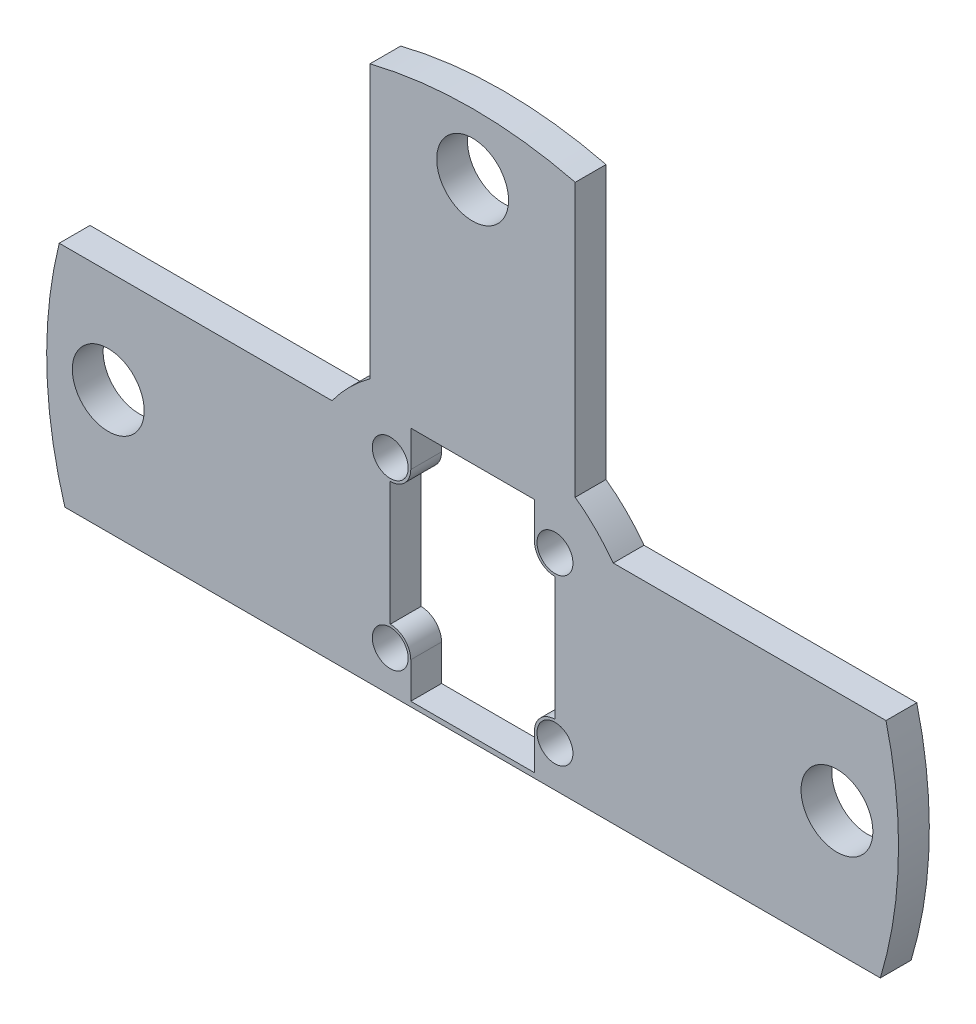
ISO-10303-21;
HEADER;
FILE_DESCRIPTION(('STEP AP214'),'2;1');
FILE_NAME('part.step','',(''),(''),'','','');
FILE_SCHEMA(('AUTOMOTIVE_DESIGN { 1 0 10303 214 1 1 1 1 }'));
ENDSEC;
DATA;
#1=APPLICATION_CONTEXT('core data for automotive mechanical design processes');
#2=APPLICATION_PROTOCOL_DEFINITION('international standard','automotive_design',2000,#1);
#3=PRODUCT_CONTEXT('',#1,'mechanical');
#4=PRODUCT('Part','Part','',(#3));
#5=PRODUCT_RELATED_PRODUCT_CATEGORY('part','',(#4));
#6=PRODUCT_DEFINITION_FORMATION('','',#4);
#7=PRODUCT_DEFINITION_CONTEXT('part definition',#1,'design');
#8=PRODUCT_DEFINITION('design','',#6,#7);
#9=PRODUCT_DEFINITION_SHAPE('','',#8);
#10=(LENGTH_UNIT() NAMED_UNIT(*) SI_UNIT(.MILLI.,.METRE.));
#11=(NAMED_UNIT(*) PLANE_ANGLE_UNIT() SI_UNIT($,.RADIAN.));
#12=(NAMED_UNIT(*) SI_UNIT($,.STERADIAN.) SOLID_ANGLE_UNIT());
#13=UNCERTAINTY_MEASURE_WITH_UNIT(LENGTH_MEASURE(1.E-05),#10,'distance_accuracy_value','');
#14=(GEOMETRIC_REPRESENTATION_CONTEXT(3) GLOBAL_UNCERTAINTY_ASSIGNED_CONTEXT((#13)) GLOBAL_UNIT_ASSIGNED_CONTEXT((#10,
#11,#12)) REPRESENTATION_CONTEXT('',''));
#15=CARTESIAN_POINT('',(0.,0.,0.));
#16=DIRECTION('',(0.,0.,1.));
#17=DIRECTION('',(1.,0.,0.));
#18=AXIS2_PLACEMENT_3D('',#15,#16,#17);
#19=CARTESIAN_POINT('',(0.,0.,52.5));
#20=DIRECTION('',(0.,0.,-1.));
#21=DIRECTION('',(-1.,0.,0.));
#22=AXIS2_PLACEMENT_3D('',#19,#20,#21);
#23=CYLINDRICAL_SURFACE('',#22,41.5);
#24=DIRECTION('',(0.,0.,1.));
#25=VECTOR('',#24,1.);
#26=CARTESIAN_POINT('',(9.99999999999996,40.2771647462927,0.));
#27=LINE('',#26,#25);
#28=CARTESIAN_POINT('',(9.99999999999996,40.2771647462927,49.5));
#29=VERTEX_POINT('',#28);
#30=CARTESIAN_POINT('',(9.99999999999996,40.2771647462927,52.5));
#31=VERTEX_POINT('',#30);
#32=EDGE_CURVE('E211',#29,#31,#27,.T.);
#33=ORIENTED_EDGE('',*,*,#32,.F.);
#34=CARTESIAN_POINT('',(0.,0.,49.5));
#35=DIRECTION('',(0.,0.,1.));
#36=DIRECTION('',(1.,0.,0.));
#37=AXIS2_PLACEMENT_3D('',#34,#35,#36);
#38=CIRCLE('',#37,41.5);
#39=CARTESIAN_POINT('',(-9.99999999999997,40.2771647462927,49.5));
#40=VERTEX_POINT('',#39);
#41=EDGE_CURVE('E199',#29,#40,#38,.T.);
#42=ORIENTED_EDGE('',*,*,#41,.T.);
#43=DIRECTION('',(0.,0.,1.));
#44=VECTOR('',#43,1.);
#45=CARTESIAN_POINT('',(-9.99999999999997,40.2771647462927,0.));
#46=LINE('',#45,#44);
#47=CARTESIAN_POINT('',(-9.99999999999997,40.2771647462927,52.5));
#48=VERTEX_POINT('',#47);
#49=EDGE_CURVE('E209',#40,#48,#46,.T.);
#50=ORIENTED_EDGE('',*,*,#49,.T.);
#51=CARTESIAN_POINT('',(0.,0.,52.5));
#52=DIRECTION('',(0.,0.,1.));
#53=DIRECTION('',(1.,0.,0.));
#54=AXIS2_PLACEMENT_3D('',#51,#52,#53);
#55=CIRCLE('',#54,41.5);
#56=EDGE_CURVE('E361',#31,#48,#55,.T.);
#57=ORIENTED_EDGE('',*,*,#56,.F.);
#58=EDGE_LOOP('',(#33,#42,#50,#57));
#59=FACE_BOUND('',#58,.T.);
#60=ADVANCED_FACE('F45',(#59),#23,.T.);
#61=DIRECTION('',(0.,0.,1.));
#62=VECTOR('',#61,1.);
#63=CARTESIAN_POINT('',(-40.2771647462927,10.,0.));
#64=LINE('',#63,#62);
#65=CARTESIAN_POINT('',(-40.2771647462927,10.,49.5));
#66=VERTEX_POINT('',#65);
#67=CARTESIAN_POINT('',(-40.2771647462927,10.,52.5));
#68=VERTEX_POINT('',#67);
#69=EDGE_CURVE('E234',#66,#68,#64,.T.);
#70=ORIENTED_EDGE('',*,*,#69,.F.);
#71=CARTESIAN_POINT('',(0.,0.,49.5));
#72=DIRECTION('',(0.,0.,1.));
#73=DIRECTION('',(1.,0.,0.));
#74=AXIS2_PLACEMENT_3D('',#71,#72,#73);
#75=CIRCLE('',#74,41.5);
#76=CARTESIAN_POINT('',(-39.7271947159625,-12.,49.5));
#77=VERTEX_POINT('',#76);
#78=EDGE_CURVE('E214',#66,#77,#75,.T.);
#79=ORIENTED_EDGE('',*,*,#78,.T.);
#80=DIRECTION('',(0.,0.,-1.));
#81=VECTOR('',#80,1.);
#82=CARTESIAN_POINT('',(-39.7271947159625,-12.,52.5));
#83=LINE('',#82,#81);
#84=CARTESIAN_POINT('',(-39.7271947159625,-12.,52.5));
#85=VERTEX_POINT('',#84);
#86=EDGE_CURVE('E360',#85,#77,#83,.T.);
#87=ORIENTED_EDGE('',*,*,#86,.F.);
#88=EDGE_CURVE('E355',#68,#85,#55,.T.);
#89=ORIENTED_EDGE('',*,*,#88,.F.);
#90=EDGE_LOOP('',(#70,#79,#87,#89));
#91=FACE_BOUND('',#90,.T.);
#92=ADVANCED_FACE('F488',(#91),#23,.T.);
#93=CARTESIAN_POINT('',(0.,0.,52.5));
#94=DIRECTION('',(0.,0.,1.));
#95=DIRECTION('',(1.,0.,0.));
#96=AXIS2_PLACEMENT_3D('',#93,#94,#95);
#97=PLANE('',#96);
#98=DIRECTION('',(0.,-1.,0.));
#99=VECTOR('',#98,1.);
#100=CARTESIAN_POINT('',(-6.025,8.025,52.5));
#101=LINE('',#100,#99);
#102=CARTESIAN_POINT('',(-6.025,11.525,52.5));
#103=VERTEX_POINT('',#102);
#104=CARTESIAN_POINT('',(-6.025,8.025,52.5));
#105=VERTEX_POINT('',#104);
#106=EDGE_CURVE('E513',#103,#105,#101,.T.);
#107=ORIENTED_EDGE('',*,*,#106,.F.);
#108=DIRECTION('',(-1.,0.,0.));
#109=VECTOR('',#108,1.);
#110=CARTESIAN_POINT('',(-6.025,11.525,52.5));
#111=LINE('',#110,#109);
#112=CARTESIAN_POINT('',(6.025,11.525,52.5));
#113=VERTEX_POINT('',#112);
#114=EDGE_CURVE('E509',#113,#103,#111,.T.);
#115=ORIENTED_EDGE('',*,*,#114,.F.);
#116=DIRECTION('',(0.,1.,0.));
#117=VECTOR('',#116,1.);
#118=CARTESIAN_POINT('',(6.025,11.525,52.5));
#119=LINE('',#118,#117);
#120=CARTESIAN_POINT('',(6.025,8.02499999999999,52.5));
#121=VERTEX_POINT('',#120);
#122=EDGE_CURVE('E449',#121,#113,#119,.T.);
#123=ORIENTED_EDGE('',*,*,#122,.F.);
#124=CARTESIAN_POINT('',(8.025,8.025,52.5));
#125=DIRECTION('',(0.,0.,-1.));
#126=DIRECTION('',(1.,0.,0.));
#127=AXIS2_PLACEMENT_3D('',#124,#125,#126);
#128=CIRCLE('',#127,2.);
#129=CARTESIAN_POINT('',(8.025,6.025,52.5));
#130=VERTEX_POINT('',#129);
#131=EDGE_CURVE('E277',#130,#121,#128,.T.);
#132=ORIENTED_EDGE('',*,*,#131,.F.);
#133=DIRECTION('',(0.,1.,0.));
#134=VECTOR('',#133,1.);
#135=CARTESIAN_POINT('',(8.025,-6.025,52.5));
#136=LINE('',#135,#134);
#137=CARTESIAN_POINT('',(8.025,-6.025,52.5));
#138=VERTEX_POINT('',#137);
#139=EDGE_CURVE('E273',#138,#130,#136,.T.);
#140=ORIENTED_EDGE('',*,*,#139,.F.);
#141=CARTESIAN_POINT('',(8.025,-8.025,52.5));
#142=DIRECTION('',(0.,0.,-1.));
#143=DIRECTION('',(1.,0.,0.));
#144=AXIS2_PLACEMENT_3D('',#141,#142,#143);
#145=CIRCLE('',#144,2.);
#146=CARTESIAN_POINT('',(6.025,-8.02499999999999,52.5));
#147=VERTEX_POINT('',#146);
#148=EDGE_CURVE('E269',#147,#138,#145,.T.);
#149=ORIENTED_EDGE('',*,*,#148,.F.);
#150=DIRECTION('',(0.,1.,0.));
#151=VECTOR('',#150,1.);
#152=CARTESIAN_POINT('',(6.025,-11.525,52.5));
#153=LINE('',#152,#151);
#154=CARTESIAN_POINT('',(6.025,-11.525,52.5));
#155=VERTEX_POINT('',#154);
#156=EDGE_CURVE('E433',#155,#147,#153,.T.);
#157=ORIENTED_EDGE('',*,*,#156,.F.);
#158=DIRECTION('',(1.,0.,0.));
#159=VECTOR('',#158,1.);
#160=CARTESIAN_POINT('',(-6.025,-11.525,52.5));
#161=LINE('',#160,#159);
#162=CARTESIAN_POINT('',(-6.025,-11.525,52.5));
#163=VERTEX_POINT('',#162);
#164=EDGE_CURVE('E437',#163,#155,#161,.T.);
#165=ORIENTED_EDGE('',*,*,#164,.F.);
#166=DIRECTION('',(0.,-1.,0.));
#167=VECTOR('',#166,1.);
#168=CARTESIAN_POINT('',(-6.025,-8.025,52.5));
#169=LINE('',#168,#167);
#170=CARTESIAN_POINT('',(-6.025,-8.025,52.5));
#171=VERTEX_POINT('',#170);
#172=EDGE_CURVE('E430',#171,#163,#169,.T.);
#173=ORIENTED_EDGE('',*,*,#172,.F.);
#174=CARTESIAN_POINT('',(-8.025,-8.025,52.5));
#175=DIRECTION('',(0.,0.,-1.));
#176=DIRECTION('',(1.,0.,0.));
#177=AXIS2_PLACEMENT_3D('',#174,#175,#176);
#178=CIRCLE('',#177,2.);
#179=CARTESIAN_POINT('',(-8.025,-6.025,52.5));
#180=VERTEX_POINT('',#179);
#181=EDGE_CURVE('E265',#180,#171,#178,.T.);
#182=ORIENTED_EDGE('',*,*,#181,.F.);
#183=DIRECTION('',(0.,-1.,0.));
#184=VECTOR('',#183,1.);
#185=CARTESIAN_POINT('',(-8.025,6.025,52.5));
#186=LINE('',#185,#184);
#187=CARTESIAN_POINT('',(-8.025,6.025,52.5));
#188=VERTEX_POINT('',#187);
#189=EDGE_CURVE('E226',#188,#180,#186,.T.);
#190=ORIENTED_EDGE('',*,*,#189,.F.);
#191=CARTESIAN_POINT('',(-8.025,8.025,52.5));
#192=DIRECTION('',(0.,0.,-1.));
#193=DIRECTION('',(1.,0.,0.));
#194=AXIS2_PLACEMENT_3D('',#191,#192,#193);
#195=CIRCLE('',#194,2.);
#196=EDGE_CURVE('E221',#105,#188,#195,.T.);
#197=ORIENTED_EDGE('',*,*,#196,.F.);
#198=EDGE_LOOP('',(#107,#115,#123,#132,#140,#149,#157,#165,#173,#182,#190,#197));
#199=FACE_BOUND('',#198,.T.);
#200=DIRECTION('',(0.,1.,0.));
#201=VECTOR('',#200,1.);
#202=CARTESIAN_POINT('',(-10.0000000000001,13.698766072022,52.5));
#203=LINE('',#202,#201);
#204=CARTESIAN_POINT('',(-10.0000000000001,13.698766072022,52.5));
#205=VERTEX_POINT('',#204);
#206=EDGE_CURVE('E218',#205,#48,#203,.T.);
#207=ORIENTED_EDGE('',*,*,#206,.F.);
#208=CARTESIAN_POINT('',(0.,0.,52.5));
#209=DIRECTION('',(0.,0.,-1.));
#210=DIRECTION('',(1.,0.,0.));
#211=AXIS2_PLACEMENT_3D('',#208,#209,#210);
#212=CIRCLE('',#211,16.9604301801571);
#213=CARTESIAN_POINT('',(-13.6987660720221,10.,52.5));
#214=VERTEX_POINT('',#213);
#215=EDGE_CURVE('E463',#214,#205,#212,.T.);
#216=ORIENTED_EDGE('',*,*,#215,.F.);
#217=DIRECTION('',(1.,0.,0.));
#218=VECTOR('',#217,1.);
#219=CARTESIAN_POINT('',(-40.2771647462927,10.,52.5));
#220=LINE('',#219,#218);
#221=EDGE_CURVE('E260',#68,#214,#220,.T.);
#222=ORIENTED_EDGE('',*,*,#221,.F.);
#223=ORIENTED_EDGE('',*,*,#88,.T.);
#224=DIRECTION('',(1.,0.,0.));
#225=VECTOR('',#224,1.);
#226=CARTESIAN_POINT('',(26.9490259564237,-12.,52.5));
#227=LINE('',#226,#225);
#228=CARTESIAN_POINT('',(39.7271947159625,-12.,52.5));
#229=VERTEX_POINT('',#228);
#230=EDGE_CURVE('E352',#85,#229,#227,.T.);
#231=ORIENTED_EDGE('',*,*,#230,.T.);
#232=CARTESIAN_POINT('',(40.2771647462926,10.,52.5));
#233=VERTEX_POINT('',#232);
#234=EDGE_CURVE('E356',#229,#233,#55,.T.);
#235=ORIENTED_EDGE('',*,*,#234,.T.);
#236=DIRECTION('',(1.,0.,0.));
#237=VECTOR('',#236,1.);
#238=CARTESIAN_POINT('',(40.2771647462927,10.,52.5));
#239=LINE('',#238,#237);
#240=CARTESIAN_POINT('',(13.6987660720221,10.,52.5));
#241=VERTEX_POINT('',#240);
#242=EDGE_CURVE('E253',#241,#233,#239,.T.);
#243=ORIENTED_EDGE('',*,*,#242,.F.);
#244=CARTESIAN_POINT('',(0.,0.,52.5));
#245=DIRECTION('',(0.,0.,-1.));
#246=DIRECTION('',(1.,0.,0.));
#247=AXIS2_PLACEMENT_3D('',#244,#245,#246);
#248=CIRCLE('',#247,16.9604301801571);
#249=CARTESIAN_POINT('',(10.0000000000001,13.698766072022,52.5));
#250=VERTEX_POINT('',#249);
#251=EDGE_CURVE('E257',#250,#241,#248,.T.);
#252=ORIENTED_EDGE('',*,*,#251,.F.);
#253=DIRECTION('',(0.,-1.,0.));
#254=VECTOR('',#253,1.);
#255=CARTESIAN_POINT('',(10.0000000000001,13.698766072022,52.5));
#256=LINE('',#255,#254);
#257=EDGE_CURVE('E240',#31,#250,#256,.T.);
#258=ORIENTED_EDGE('',*,*,#257,.F.);
#259=ORIENTED_EDGE('',*,*,#56,.T.);
#260=EDGE_LOOP('',(#207,#216,#222,#223,#231,#235,#243,#252,#258,#259));
#261=FACE_BOUND('',#260,.T.);
#262=CARTESIAN_POINT('',(0.,35.5,52.5));
#263=DIRECTION('',(0.,0.,1.));
#264=DIRECTION('',(1.,0.,0.));
#265=AXIS2_PLACEMENT_3D('',#262,#263,#264);
#266=CIRCLE('',#265,3.5);
#267=CARTESIAN_POINT('',(3.5,35.5,52.5));
#268=VERTEX_POINT('',#267);
#269=EDGE_CURVE('E344',#268,#268,#266,.T.);
#270=ORIENTED_EDGE('',*,*,#269,.F.);
#271=EDGE_LOOP('',(#270));
#272=FACE_BOUND('',#271,.T.);
#273=CARTESIAN_POINT('',(-35.5,0.,52.5));
#274=DIRECTION('',(0.,0.,1.));
#275=DIRECTION('',(1.,0.,0.));
#276=AXIS2_PLACEMENT_3D('',#273,#274,#275);
#277=CIRCLE('',#276,3.5);
#278=CARTESIAN_POINT('',(-32.,0.,52.5));
#279=VERTEX_POINT('',#278);
#280=EDGE_CURVE('E348',#279,#279,#277,.T.);
#281=ORIENTED_EDGE('',*,*,#280,.F.);
#282=EDGE_LOOP('',(#281));
#283=FACE_BOUND('',#282,.T.);
#284=CARTESIAN_POINT('',(35.5,0.,52.5));
#285=DIRECTION('',(0.,0.,1.));
#286=DIRECTION('',(1.,0.,0.));
#287=AXIS2_PLACEMENT_3D('',#284,#285,#286);
#288=CIRCLE('',#287,3.5);
#289=CARTESIAN_POINT('',(39.,0.,52.5));
#290=VERTEX_POINT('',#289);
#291=EDGE_CURVE('E337',#290,#290,#288,.T.);
#292=ORIENTED_EDGE('',*,*,#291,.F.);
#293=EDGE_LOOP('',(#292));
#294=FACE_BOUND('',#293,.T.);
#295=CARTESIAN_POINT('',(8.025,-8.025,52.5));
#296=DIRECTION('',(0.,0.,1.));
#297=DIRECTION('',(1.,0.,0.));
#298=AXIS2_PLACEMENT_3D('',#295,#296,#297);
#299=CIRCLE('',#298,1.75);
#300=CARTESIAN_POINT('',(9.775,-8.025,52.5));
#301=VERTEX_POINT('',#300);
#302=EDGE_CURVE('E286',#301,#301,#299,.T.);
#303=ORIENTED_EDGE('',*,*,#302,.F.);
#304=EDGE_LOOP('',(#303));
#305=FACE_BOUND('',#304,.T.);
#306=CARTESIAN_POINT('',(-8.025,-8.025,52.5));
#307=DIRECTION('',(0.,0.,1.));
#308=DIRECTION('',(1.,0.,0.));
#309=AXIS2_PLACEMENT_3D('',#306,#307,#308);
#310=CIRCLE('',#309,1.75);
#311=CARTESIAN_POINT('',(-6.275,-8.025,52.5));
#312=VERTEX_POINT('',#311);
#313=EDGE_CURVE('E313',#312,#312,#310,.T.);
#314=ORIENTED_EDGE('',*,*,#313,.F.);
#315=EDGE_LOOP('',(#314));
#316=FACE_BOUND('',#315,.T.);
#317=CARTESIAN_POINT('',(8.025,8.025,52.5));
#318=DIRECTION('',(0.,0.,1.));
#319=DIRECTION('',(1.,0.,0.));
#320=AXIS2_PLACEMENT_3D('',#317,#318,#319);
#321=CIRCLE('',#320,1.75);
#322=CARTESIAN_POINT('',(9.775,8.025,52.5));
#323=VERTEX_POINT('',#322);
#324=EDGE_CURVE('E321',#323,#323,#321,.T.);
#325=ORIENTED_EDGE('',*,*,#324,.F.);
#326=EDGE_LOOP('',(#325));
#327=FACE_BOUND('',#326,.T.);
#328=CARTESIAN_POINT('',(-8.025,8.025,52.5));
#329=DIRECTION('',(0.,0.,1.));
#330=DIRECTION('',(1.,0.,0.));
#331=AXIS2_PLACEMENT_3D('',#328,#329,#330);
#332=CIRCLE('',#331,1.75);
#333=CARTESIAN_POINT('',(-6.275,8.025,52.5));
#334=VERTEX_POINT('',#333);
#335=EDGE_CURVE('E329',#334,#334,#332,.T.);
#336=ORIENTED_EDGE('',*,*,#335,.F.);
#337=EDGE_LOOP('',(#336));
#338=FACE_BOUND('',#337,.T.);
#339=ADVANCED_FACE('F472',(#199,#261,#272,#283,#294,#305,#316,#327,#338),#97,.T.);
#340=DIRECTION('',(0.,0.,-1.));
#341=VECTOR('',#340,1.);
#342=CARTESIAN_POINT('',(39.7271947159625,-12.,52.5));
#343=LINE('',#342,#341);
#344=CARTESIAN_POINT('',(39.7271947159625,-12.,49.5));
#345=VERTEX_POINT('',#344);
#346=EDGE_CURVE('E365',#229,#345,#343,.T.);
#347=ORIENTED_EDGE('',*,*,#346,.T.);
#348=CARTESIAN_POINT('',(0.,0.,49.5));
#349=DIRECTION('',(0.,0.,1.));
#350=DIRECTION('',(1.,0.,0.));
#351=AXIS2_PLACEMENT_3D('',#348,#349,#350);
#352=CIRCLE('',#351,41.5);
#353=CARTESIAN_POINT('',(40.2771647462926,10.,49.5));
#354=VERTEX_POINT('',#353);
#355=EDGE_CURVE('E213',#345,#354,#352,.T.);
#356=ORIENTED_EDGE('',*,*,#355,.T.);
#357=DIRECTION('',(0.,0.,1.));
#358=VECTOR('',#357,1.);
#359=CARTESIAN_POINT('',(40.2771647462926,10.,0.));
#360=LINE('',#359,#358);
#361=EDGE_CURVE('E241',#354,#233,#360,.T.);
#362=ORIENTED_EDGE('',*,*,#361,.T.);
#363=ORIENTED_EDGE('',*,*,#234,.F.);
#364=EDGE_LOOP('',(#347,#356,#362,#363));
#365=FACE_BOUND('',#364,.T.);
#366=ADVANCED_FACE('F47',(#365),#23,.T.);
#367=CARTESIAN_POINT('',(-39.7271947159625,-12.,52.5));
#368=DIRECTION('',(0.,1.,0.));
#369=DIRECTION('',(0.,0.,1.));
#370=AXIS2_PLACEMENT_3D('',#367,#368,#369);
#371=PLANE('',#370);
#372=ORIENTED_EDGE('',*,*,#86,.T.);
#373=DIRECTION('',(-1.,0.,0.));
#374=VECTOR('',#373,1.);
#375=CARTESIAN_POINT('',(0.,-12.,49.5));
#376=LINE('',#375,#374);
#377=EDGE_CURVE('E393',#345,#77,#376,.T.);
#378=ORIENTED_EDGE('',*,*,#377,.F.);
#379=ORIENTED_EDGE('',*,*,#346,.F.);
#380=ORIENTED_EDGE('',*,*,#230,.F.);
#381=EDGE_LOOP('',(#372,#378,#379,#380));
#382=FACE_BOUND('',#381,.T.);
#383=ADVANCED_FACE('F485',(#382),#371,.F.);
#384=CARTESIAN_POINT('',(-35.5,0.,52.5));
#385=DIRECTION('',(0.,0.,-1.));
#386=DIRECTION('',(-1.,0.,0.));
#387=AXIS2_PLACEMENT_3D('',#384,#385,#386);
#388=CYLINDRICAL_SURFACE('',#387,3.5);
#389=CARTESIAN_POINT('',(-35.5,0.,49.5));
#390=DIRECTION('',(0.,0.,1.));
#391=DIRECTION('',(1.,0.,0.));
#392=AXIS2_PLACEMENT_3D('',#389,#390,#391);
#393=CIRCLE('',#392,3.5);
#394=CARTESIAN_POINT('',(-32.,0.,49.5));
#395=VERTEX_POINT('',#394);
#396=EDGE_CURVE('E439',#395,#395,#393,.T.);
#397=ORIENTED_EDGE('',*,*,#396,.F.);
#398=EDGE_LOOP('',(#397));
#399=FACE_BOUND('',#398,.T.);
#400=ORIENTED_EDGE('',*,*,#280,.T.);
#401=EDGE_LOOP('',(#400));
#402=FACE_BOUND('',#401,.T.);
#403=ADVANCED_FACE('F579',(#399,#402),#388,.F.);
#404=CARTESIAN_POINT('',(0.,35.5,52.5));
#405=DIRECTION('',(0.,0.,-1.));
#406=DIRECTION('',(-1.,0.,0.));
#407=AXIS2_PLACEMENT_3D('',#404,#405,#406);
#408=CYLINDRICAL_SURFACE('',#407,3.5);
#409=CARTESIAN_POINT('',(0.,35.5,49.5));
#410=DIRECTION('',(0.,0.,1.));
#411=DIRECTION('',(1.,0.,0.));
#412=AXIS2_PLACEMENT_3D('',#409,#410,#411);
#413=CIRCLE('',#412,3.5);
#414=CARTESIAN_POINT('',(3.5,35.5,49.5));
#415=VERTEX_POINT('',#414);
#416=EDGE_CURVE('E499',#415,#415,#413,.T.);
#417=ORIENTED_EDGE('',*,*,#416,.F.);
#418=EDGE_LOOP('',(#417));
#419=FACE_BOUND('',#418,.T.);
#420=ORIENTED_EDGE('',*,*,#269,.T.);
#421=EDGE_LOOP('',(#420));
#422=FACE_BOUND('',#421,.T.);
#423=ADVANCED_FACE('F677',(#419,#422),#408,.F.);
#424=CARTESIAN_POINT('',(35.5,0.,52.5));
#425=DIRECTION('',(0.,0.,-1.));
#426=DIRECTION('',(-1.,0.,0.));
#427=AXIS2_PLACEMENT_3D('',#424,#425,#426);
#428=CYLINDRICAL_SURFACE('',#427,3.5);
#429=CARTESIAN_POINT('',(35.5,0.,49.5));
#430=DIRECTION('',(0.,0.,1.));
#431=DIRECTION('',(1.,0.,0.));
#432=AXIS2_PLACEMENT_3D('',#429,#430,#431);
#433=CIRCLE('',#432,3.5);
#434=CARTESIAN_POINT('',(39.,0.,49.5));
#435=VERTEX_POINT('',#434);
#436=EDGE_CURVE('E495',#435,#435,#433,.T.);
#437=ORIENTED_EDGE('',*,*,#436,.F.);
#438=EDGE_LOOP('',(#437));
#439=FACE_BOUND('',#438,.T.);
#440=ORIENTED_EDGE('',*,*,#291,.T.);
#441=EDGE_LOOP('',(#440));
#442=FACE_BOUND('',#441,.T.);
#443=ADVANCED_FACE('F665',(#439,#442),#428,.F.);
#444=CARTESIAN_POINT('',(0.,0.,49.5));
#445=DIRECTION('',(0.,0.,1.));
#446=DIRECTION('',(1.,0.,0.));
#447=AXIS2_PLACEMENT_3D('',#444,#445,#446);
#448=PLANE('',#447);
#449=DIRECTION('',(-1.,0.,0.));
#450=VECTOR('',#449,1.);
#451=CARTESIAN_POINT('',(0.,11.525,49.5));
#452=LINE('',#451,#450);
#453=CARTESIAN_POINT('',(6.025,11.525,49.5));
#454=VERTEX_POINT('',#453);
#455=CARTESIAN_POINT('',(-6.025,11.525,49.5));
#456=VERTEX_POINT('',#455);
#457=EDGE_CURVE('E11',#454,#456,#452,.T.);
#458=ORIENTED_EDGE('',*,*,#457,.T.);
#459=DIRECTION('',(0.,-1.,0.));
#460=VECTOR('',#459,1.);
#461=CARTESIAN_POINT('',(-6.025,0.,49.5));
#462=LINE('',#461,#460);
#463=CARTESIAN_POINT('',(-6.025,8.025,49.5));
#464=VERTEX_POINT('',#463);
#465=EDGE_CURVE('E249',#456,#464,#462,.T.);
#466=ORIENTED_EDGE('',*,*,#465,.T.);
#467=CARTESIAN_POINT('',(-8.025,8.025,49.5));
#468=DIRECTION('',(0.,0.,1.));
#469=DIRECTION('',(1.,0.,0.));
#470=AXIS2_PLACEMENT_3D('',#467,#468,#469);
#471=CIRCLE('',#470,2.);
#472=CARTESIAN_POINT('',(-8.025,6.025,49.5));
#473=VERTEX_POINT('',#472);
#474=EDGE_CURVE('E389',#464,#473,#471,.F.);
#475=ORIENTED_EDGE('',*,*,#474,.T.);
#476=DIRECTION('',(0.,-1.,0.));
#477=VECTOR('',#476,1.);
#478=CARTESIAN_POINT('',(-8.025,0.,49.5));
#479=LINE('',#478,#477);
#480=CARTESIAN_POINT('',(-8.025,-6.025,49.5));
#481=VERTEX_POINT('',#480);
#482=EDGE_CURVE('E369',#473,#481,#479,.T.);
#483=ORIENTED_EDGE('',*,*,#482,.T.);
#484=CARTESIAN_POINT('',(-8.025,-8.025,49.5));
#485=DIRECTION('',(0.,0.,1.));
#486=DIRECTION('',(1.,0.,0.));
#487=AXIS2_PLACEMENT_3D('',#484,#485,#486);
#488=CIRCLE('',#487,2.);
#489=CARTESIAN_POINT('',(-6.025,-8.025,49.5));
#490=VERTEX_POINT('',#489);
#491=EDGE_CURVE('E373',#481,#490,#488,.F.);
#492=ORIENTED_EDGE('',*,*,#491,.T.);
#493=DIRECTION('',(0.,-1.,0.));
#494=VECTOR('',#493,1.);
#495=CARTESIAN_POINT('',(-6.025,0.,49.5));
#496=LINE('',#495,#494);
#497=CARTESIAN_POINT('',(-6.025,-11.525,49.5));
#498=VERTEX_POINT('',#497);
#499=EDGE_CURVE('E417',#490,#498,#496,.T.);
#500=ORIENTED_EDGE('',*,*,#499,.T.);
#501=DIRECTION('',(1.,0.,0.));
#502=VECTOR('',#501,1.);
#503=CARTESIAN_POINT('',(0.,-11.525,49.5));
#504=LINE('',#503,#502);
#505=CARTESIAN_POINT('',(6.025,-11.525,49.5));
#506=VERTEX_POINT('',#505);
#507=EDGE_CURVE('E54',#498,#506,#504,.T.);
#508=ORIENTED_EDGE('',*,*,#507,.T.);
#509=DIRECTION('',(0.,1.,0.));
#510=VECTOR('',#509,1.);
#511=CARTESIAN_POINT('',(6.025,0.,49.5));
#512=LINE('',#511,#510);
#513=CARTESIAN_POINT('',(6.025,-8.02499999999999,49.5));
#514=VERTEX_POINT('',#513);
#515=EDGE_CURVE('E415',#506,#514,#512,.T.);
#516=ORIENTED_EDGE('',*,*,#515,.T.);
#517=CARTESIAN_POINT('',(8.025,-8.025,49.5));
#518=DIRECTION('',(0.,0.,1.));
#519=DIRECTION('',(1.,0.,0.));
#520=AXIS2_PLACEMENT_3D('',#517,#518,#519);
#521=CIRCLE('',#520,2.);
#522=CARTESIAN_POINT('',(8.025,-6.025,49.5));
#523=VERTEX_POINT('',#522);
#524=EDGE_CURVE('E377',#514,#523,#521,.F.);
#525=ORIENTED_EDGE('',*,*,#524,.T.);
#526=DIRECTION('',(0.,1.,0.));
#527=VECTOR('',#526,1.);
#528=CARTESIAN_POINT('',(8.025,0.,49.5));
#529=LINE('',#528,#527);
#530=CARTESIAN_POINT('',(8.025,6.025,49.5));
#531=VERTEX_POINT('',#530);
#532=EDGE_CURVE('E381',#523,#531,#529,.T.);
#533=ORIENTED_EDGE('',*,*,#532,.T.);
#534=CARTESIAN_POINT('',(8.025,8.025,49.5));
#535=DIRECTION('',(0.,0.,1.));
#536=DIRECTION('',(1.,0.,0.));
#537=AXIS2_PLACEMENT_3D('',#534,#535,#536);
#538=CIRCLE('',#537,2.);
#539=CARTESIAN_POINT('',(6.025,8.025,49.5));
#540=VERTEX_POINT('',#539);
#541=EDGE_CURVE('E385',#531,#540,#538,.F.);
#542=ORIENTED_EDGE('',*,*,#541,.T.);
#543=DIRECTION('',(0.,1.,0.));
#544=VECTOR('',#543,1.);
#545=CARTESIAN_POINT('',(6.025,0.,49.5));
#546=LINE('',#545,#544);
#547=EDGE_CURVE('E455',#540,#454,#546,.T.);
#548=ORIENTED_EDGE('',*,*,#547,.T.);
#549=EDGE_LOOP('',(#458,#466,#475,#483,#492,#500,#508,#516,#525,#533,#542,#548));
#550=FACE_BOUND('',#549,.T.);
#551=CARTESIAN_POINT('',(8.025,-8.025,49.5));
#552=DIRECTION('',(0.,0.,1.));
#553=DIRECTION('',(1.,0.,0.));
#554=AXIS2_PLACEMENT_3D('',#551,#552,#553);
#555=CIRCLE('',#554,1.75);
#556=CARTESIAN_POINT('',(9.775,-8.025,49.5));
#557=VERTEX_POINT('',#556);
#558=EDGE_CURVE('E309',#557,#557,#555,.T.);
#559=ORIENTED_EDGE('',*,*,#558,.T.);
#560=EDGE_LOOP('',(#559));
#561=FACE_BOUND('',#560,.T.);
#562=CARTESIAN_POINT('',(-8.025,-8.025,49.5));
#563=DIRECTION('',(0.,0.,1.));
#564=DIRECTION('',(1.,0.,0.));
#565=AXIS2_PLACEMENT_3D('',#562,#563,#564);
#566=CIRCLE('',#565,1.75);
#567=CARTESIAN_POINT('',(-6.275,-8.025,49.5));
#568=VERTEX_POINT('',#567);
#569=EDGE_CURVE('E317',#568,#568,#566,.T.);
#570=ORIENTED_EDGE('',*,*,#569,.T.);
#571=EDGE_LOOP('',(#570));
#572=FACE_BOUND('',#571,.T.);
#573=CARTESIAN_POINT('',(8.025,8.025,49.5));
#574=DIRECTION('',(0.,0.,1.));
#575=DIRECTION('',(1.,0.,0.));
#576=AXIS2_PLACEMENT_3D('',#573,#574,#575);
#577=CIRCLE('',#576,1.75);
#578=CARTESIAN_POINT('',(9.775,8.025,49.5));
#579=VERTEX_POINT('',#578);
#580=EDGE_CURVE('E325',#579,#579,#577,.T.);
#581=ORIENTED_EDGE('',*,*,#580,.T.);
#582=EDGE_LOOP('',(#581));
#583=FACE_BOUND('',#582,.T.);
#584=CARTESIAN_POINT('',(-8.025,8.025,49.5));
#585=DIRECTION('',(0.,0.,1.));
#586=DIRECTION('',(1.,0.,0.));
#587=AXIS2_PLACEMENT_3D('',#584,#585,#586);
#588=CIRCLE('',#587,1.75);
#589=CARTESIAN_POINT('',(-6.275,8.025,49.5));
#590=VERTEX_POINT('',#589);
#591=EDGE_CURVE('E333',#590,#590,#588,.T.);
#592=ORIENTED_EDGE('',*,*,#591,.T.);
#593=EDGE_LOOP('',(#592));
#594=FACE_BOUND('',#593,.T.);
#595=CARTESIAN_POINT('',(0.,0.,49.5));
#596=DIRECTION('',(0.,0.,1.));
#597=DIRECTION('',(1.,0.,0.));
#598=AXIS2_PLACEMENT_3D('',#595,#596,#597);
#599=CIRCLE('',#598,16.9604301801571);
#600=CARTESIAN_POINT('',(-13.6987660720221,10.,49.5));
#601=VERTEX_POINT('',#600);
#602=CARTESIAN_POINT('',(-10.0000000000001,13.698766072022,49.5));
#603=VERTEX_POINT('',#602);
#604=EDGE_CURVE('E201',#601,#603,#599,.F.);
#605=ORIENTED_EDGE('',*,*,#604,.T.);
#606=DIRECTION('',(0.,1.,0.));
#607=VECTOR('',#606,1.);
#608=CARTESIAN_POINT('',(-10.0000000000002,0.,49.5));
#609=LINE('',#608,#607);
#610=EDGE_CURVE('E194',#603,#40,#609,.T.);
#611=ORIENTED_EDGE('',*,*,#610,.T.);
#612=ORIENTED_EDGE('',*,*,#41,.F.);
#613=DIRECTION('',(0.,-1.,0.));
#614=VECTOR('',#613,1.);
#615=CARTESIAN_POINT('',(10.0000000000002,0.,49.5));
#616=LINE('',#615,#614);
#617=CARTESIAN_POINT('',(10.0000000000001,13.698766072022,49.5));
#618=VERTEX_POINT('',#617);
#619=EDGE_CURVE('E403',#29,#618,#616,.T.);
#620=ORIENTED_EDGE('',*,*,#619,.T.);
#621=CARTESIAN_POINT('',(0.,0.,49.5));
#622=DIRECTION('',(0.,0.,1.));
#623=DIRECTION('',(1.,0.,0.));
#624=AXIS2_PLACEMENT_3D('',#621,#622,#623);
#625=CIRCLE('',#624,16.9604301801571);
#626=CARTESIAN_POINT('',(13.6987660720221,10.,49.5));
#627=VERTEX_POINT('',#626);
#628=EDGE_CURVE('E399',#618,#627,#625,.F.);
#629=ORIENTED_EDGE('',*,*,#628,.T.);
#630=DIRECTION('',(1.,0.,0.));
#631=VECTOR('',#630,1.);
#632=CARTESIAN_POINT('',(0.,10.,49.5));
#633=LINE('',#632,#631);
#634=EDGE_CURVE('E396',#627,#354,#633,.T.);
#635=ORIENTED_EDGE('',*,*,#634,.T.);
#636=ORIENTED_EDGE('',*,*,#355,.F.);
#637=ORIENTED_EDGE('',*,*,#377,.T.);
#638=ORIENTED_EDGE('',*,*,#78,.F.);
#639=DIRECTION('',(1.,0.,0.));
#640=VECTOR('',#639,1.);
#641=CARTESIAN_POINT('',(0.,10.,49.5));
#642=LINE('',#641,#640);
#643=EDGE_CURVE('E61',#66,#601,#642,.T.);
#644=ORIENTED_EDGE('',*,*,#643,.T.);
#645=EDGE_LOOP('',(#605,#611,#612,#620,#629,#635,#636,#637,#638,#644));
#646=FACE_BOUND('',#645,.T.);
#647=ORIENTED_EDGE('',*,*,#436,.T.);
#648=EDGE_LOOP('',(#647));
#649=FACE_BOUND('',#648,.T.);
#650=ORIENTED_EDGE('',*,*,#396,.T.);
#651=EDGE_LOOP('',(#650));
#652=FACE_BOUND('',#651,.T.);
#653=ORIENTED_EDGE('',*,*,#416,.T.);
#654=EDGE_LOOP('',(#653));
#655=FACE_BOUND('',#654,.T.);
#656=ADVANCED_FACE('F196',(#550,#561,#572,#583,#594,#646,#649,#652,#655),#448,.F.);
#657=CARTESIAN_POINT('',(-8.025,8.025,49.5));
#658=DIRECTION('',(0.,0.,1.));
#659=DIRECTION('',(1.,0.,0.));
#660=AXIS2_PLACEMENT_3D('',#657,#658,#659);
#661=CYLINDRICAL_SURFACE('',#660,1.75);
#662=ORIENTED_EDGE('',*,*,#591,.F.);
#663=EDGE_LOOP('',(#662));
#664=FACE_BOUND('',#663,.T.);
#665=ORIENTED_EDGE('',*,*,#335,.T.);
#666=EDGE_LOOP('',(#665));
#667=FACE_BOUND('',#666,.T.);
#668=ADVANCED_FACE('F664',(#664,#667),#661,.F.);
#669=CARTESIAN_POINT('',(8.025,8.025,49.5));
#670=DIRECTION('',(0.,0.,1.));
#671=DIRECTION('',(1.,0.,0.));
#672=AXIS2_PLACEMENT_3D('',#669,#670,#671);
#673=CYLINDRICAL_SURFACE('',#672,1.75);
#674=ORIENTED_EDGE('',*,*,#580,.F.);
#675=EDGE_LOOP('',(#674));
#676=FACE_BOUND('',#675,.T.);
#677=ORIENTED_EDGE('',*,*,#324,.T.);
#678=EDGE_LOOP('',(#677));
#679=FACE_BOUND('',#678,.T.);
#680=ADVANCED_FACE('F793',(#676,#679),#673,.F.);
#681=CARTESIAN_POINT('',(-8.025,-8.025,49.5));
#682=DIRECTION('',(0.,0.,1.));
#683=DIRECTION('',(1.,0.,0.));
#684=AXIS2_PLACEMENT_3D('',#681,#682,#683);
#685=CYLINDRICAL_SURFACE('',#684,1.75);
#686=ORIENTED_EDGE('',*,*,#569,.F.);
#687=EDGE_LOOP('',(#686));
#688=FACE_BOUND('',#687,.T.);
#689=ORIENTED_EDGE('',*,*,#313,.T.);
#690=EDGE_LOOP('',(#689));
#691=FACE_BOUND('',#690,.T.);
#692=ADVANCED_FACE('F788',(#688,#691),#685,.F.);
#693=CARTESIAN_POINT('',(8.025,-8.025,49.5));
#694=DIRECTION('',(0.,0.,1.));
#695=DIRECTION('',(1.,0.,0.));
#696=AXIS2_PLACEMENT_3D('',#693,#694,#695);
#697=CYLINDRICAL_SURFACE('',#696,1.75);
#698=ORIENTED_EDGE('',*,*,#558,.F.);
#699=EDGE_LOOP('',(#698));
#700=FACE_BOUND('',#699,.T.);
#701=ORIENTED_EDGE('',*,*,#302,.T.);
#702=EDGE_LOOP('',(#701));
#703=FACE_BOUND('',#702,.T.);
#704=ADVANCED_FACE('F766',(#700,#703),#697,.F.);
#705=CARTESIAN_POINT('',(-8.025,8.025,0.));
#706=DIRECTION('',(0.,0.,1.));
#707=DIRECTION('',(1.,0.,0.));
#708=AXIS2_PLACEMENT_3D('',#705,#706,#707);
#709=CYLINDRICAL_SURFACE('',#708,2.);
#710=DIRECTION('',(0.,0.,1.));
#711=VECTOR('',#710,1.);
#712=CARTESIAN_POINT('',(-6.025,8.025,0.));
#713=LINE('',#712,#711);
#714=EDGE_CURVE('E282',#464,#105,#713,.T.);
#715=ORIENTED_EDGE('',*,*,#714,.T.);
#716=ORIENTED_EDGE('',*,*,#196,.T.);
#717=DIRECTION('',(0.,0.,1.));
#718=VECTOR('',#717,1.);
#719=CARTESIAN_POINT('',(-8.025,6.025,0.));
#720=LINE('',#719,#718);
#721=EDGE_CURVE('E281',#473,#188,#720,.T.);
#722=ORIENTED_EDGE('',*,*,#721,.F.);
#723=ORIENTED_EDGE('',*,*,#474,.F.);
#724=EDGE_LOOP('',(#715,#716,#722,#723));
#725=FACE_BOUND('',#724,.T.);
#726=ADVANCED_FACE('F535',(#725),#709,.T.);
#727=CARTESIAN_POINT('',(8.025,8.025,0.));
#728=DIRECTION('',(0.,0.,1.));
#729=DIRECTION('',(1.,0.,0.));
#730=AXIS2_PLACEMENT_3D('',#727,#728,#729);
#731=CYLINDRICAL_SURFACE('',#730,2.);
#732=DIRECTION('',(0.,0.,1.));
#733=VECTOR('',#732,1.);
#734=CARTESIAN_POINT('',(8.025,6.025,0.));
#735=LINE('',#734,#733);
#736=EDGE_CURVE('E290',#531,#130,#735,.T.);
#737=ORIENTED_EDGE('',*,*,#736,.T.);
#738=ORIENTED_EDGE('',*,*,#131,.T.);
#739=DIRECTION('',(0.,0.,1.));
#740=VECTOR('',#739,1.);
#741=CARTESIAN_POINT('',(6.025,8.025,0.));
#742=LINE('',#741,#740);
#743=EDGE_CURVE('E287',#540,#121,#742,.T.);
#744=ORIENTED_EDGE('',*,*,#743,.F.);
#745=ORIENTED_EDGE('',*,*,#541,.F.);
#746=EDGE_LOOP('',(#737,#738,#744,#745));
#747=FACE_BOUND('',#746,.T.);
#748=ADVANCED_FACE('F538',(#747),#731,.T.);
#749=CARTESIAN_POINT('',(8.025,-6.025,0.));
#750=DIRECTION('',(1.,0.,0.));
#751=DIRECTION('',(0.,0.,-1.));
#752=AXIS2_PLACEMENT_3D('',#749,#750,#751);
#753=PLANE('',#752);
#754=DIRECTION('',(0.,0.,1.));
#755=VECTOR('',#754,1.);
#756=CARTESIAN_POINT('',(8.025,-6.025,0.));
#757=LINE('',#756,#755);
#758=EDGE_CURVE('E293',#523,#138,#757,.T.);
#759=ORIENTED_EDGE('',*,*,#758,.T.);
#760=ORIENTED_EDGE('',*,*,#139,.T.);
#761=ORIENTED_EDGE('',*,*,#736,.F.);
#762=ORIENTED_EDGE('',*,*,#532,.F.);
#763=EDGE_LOOP('',(#759,#760,#761,#762));
#764=FACE_BOUND('',#763,.T.);
#765=ADVANCED_FACE('F544',(#764),#753,.F.);
#766=CARTESIAN_POINT('',(8.025,-8.025,0.));
#767=DIRECTION('',(0.,0.,1.));
#768=DIRECTION('',(1.,0.,0.));
#769=AXIS2_PLACEMENT_3D('',#766,#767,#768);
#770=CYLINDRICAL_SURFACE('',#769,2.);
#771=DIRECTION('',(0.,0.,1.));
#772=VECTOR('',#771,1.);
#773=CARTESIAN_POINT('',(6.025,-8.025,0.));
#774=LINE('',#773,#772);
#775=EDGE_CURVE('E296',#514,#147,#774,.T.);
#776=ORIENTED_EDGE('',*,*,#775,.T.);
#777=ORIENTED_EDGE('',*,*,#148,.T.);
#778=ORIENTED_EDGE('',*,*,#758,.F.);
#779=ORIENTED_EDGE('',*,*,#524,.F.);
#780=EDGE_LOOP('',(#776,#777,#778,#779));
#781=FACE_BOUND('',#780,.T.);
#782=ADVANCED_FACE('F547',(#781),#770,.T.);
#783=CARTESIAN_POINT('',(-8.025,-8.025,0.));
#784=DIRECTION('',(0.,0.,1.));
#785=DIRECTION('',(1.,0.,0.));
#786=AXIS2_PLACEMENT_3D('',#783,#784,#785);
#787=CYLINDRICAL_SURFACE('',#786,2.);
#788=DIRECTION('',(0.,0.,1.));
#789=VECTOR('',#788,1.);
#790=CARTESIAN_POINT('',(-8.025,-6.025,0.));
#791=LINE('',#790,#789);
#792=EDGE_CURVE('E303',#481,#180,#791,.T.);
#793=ORIENTED_EDGE('',*,*,#792,.T.);
#794=ORIENTED_EDGE('',*,*,#181,.T.);
#795=DIRECTION('',(0.,0.,1.));
#796=VECTOR('',#795,1.);
#797=CARTESIAN_POINT('',(-6.025,-8.025,0.));
#798=LINE('',#797,#796);
#799=EDGE_CURVE('E300',#490,#171,#798,.T.);
#800=ORIENTED_EDGE('',*,*,#799,.F.);
#801=ORIENTED_EDGE('',*,*,#491,.F.);
#802=EDGE_LOOP('',(#793,#794,#800,#801));
#803=FACE_BOUND('',#802,.T.);
#804=ADVANCED_FACE('F552',(#803),#787,.T.);
#805=CARTESIAN_POINT('',(-8.025,6.025,0.));
#806=DIRECTION('',(-1.,0.,0.));
#807=DIRECTION('',(0.,0.,1.));
#808=AXIS2_PLACEMENT_3D('',#805,#806,#807);
#809=PLANE('',#808);
#810=ORIENTED_EDGE('',*,*,#721,.T.);
#811=ORIENTED_EDGE('',*,*,#189,.T.);
#812=ORIENTED_EDGE('',*,*,#792,.F.);
#813=ORIENTED_EDGE('',*,*,#482,.F.);
#814=EDGE_LOOP('',(#810,#811,#812,#813));
#815=FACE_BOUND('',#814,.T.);
#816=ADVANCED_FACE('F555',(#815),#809,.F.);
#817=CARTESIAN_POINT('',(0.,0.,0.));
#818=DIRECTION('',(0.,0.,1.));
#819=DIRECTION('',(1.,0.,0.));
#820=AXIS2_PLACEMENT_3D('',#817,#818,#819);
#821=CYLINDRICAL_SURFACE('',#820,16.9604301801571);
#822=DIRECTION('',(0.,0.,1.));
#823=VECTOR('',#822,1.);
#824=CARTESIAN_POINT('',(10.0000000000001,13.698766072022,0.));
#825=LINE('',#824,#823);
#826=EDGE_CURVE('E246',#618,#250,#825,.T.);
#827=ORIENTED_EDGE('',*,*,#826,.T.);
#828=ORIENTED_EDGE('',*,*,#251,.T.);
#829=DIRECTION('',(0.,0.,1.));
#830=VECTOR('',#829,1.);
#831=CARTESIAN_POINT('',(13.6987660720221,10.,0.));
#832=LINE('',#831,#830);
#833=EDGE_CURVE('E237',#627,#241,#832,.T.);
#834=ORIENTED_EDGE('',*,*,#833,.F.);
#835=ORIENTED_EDGE('',*,*,#628,.F.);
#836=EDGE_LOOP('',(#827,#828,#834,#835));
#837=FACE_BOUND('',#836,.T.);
#838=ADVANCED_FACE('F557',(#837),#821,.T.);
#839=CARTESIAN_POINT('',(10.0000000000001,13.698766072022,0.));
#840=DIRECTION('',(-1.,0.,0.));
#841=DIRECTION('',(0.,-1.,0.));
#842=AXIS2_PLACEMENT_3D('',#839,#840,#841);
#843=PLANE('',#842);
#844=ORIENTED_EDGE('',*,*,#619,.F.);
#845=ORIENTED_EDGE('',*,*,#32,.T.);
#846=ORIENTED_EDGE('',*,*,#257,.T.);
#847=ORIENTED_EDGE('',*,*,#826,.F.);
#848=EDGE_LOOP('',(#844,#845,#846,#847));
#849=FACE_BOUND('',#848,.T.);
#850=ADVANCED_FACE('F563',(#849),#843,.F.);
#851=CARTESIAN_POINT('',(40.2771647462927,10.,0.));
#852=DIRECTION('',(0.,-1.,0.));
#853=DIRECTION('',(1.,0.,0.));
#854=AXIS2_PLACEMENT_3D('',#851,#852,#853);
#855=PLANE('',#854);
#856=ORIENTED_EDGE('',*,*,#361,.F.);
#857=ORIENTED_EDGE('',*,*,#634,.F.);
#858=ORIENTED_EDGE('',*,*,#833,.T.);
#859=ORIENTED_EDGE('',*,*,#242,.T.);
#860=EDGE_LOOP('',(#856,#857,#858,#859));
#861=FACE_BOUND('',#860,.T.);
#862=ADVANCED_FACE('F586',(#861),#855,.F.);
#863=CARTESIAN_POINT('',(-10.0000000000001,13.698766072022,0.));
#864=DIRECTION('',(1.,0.,0.));
#865=DIRECTION('',(0.,1.,0.));
#866=AXIS2_PLACEMENT_3D('',#863,#864,#865);
#867=PLANE('',#866);
#868=ORIENTED_EDGE('',*,*,#49,.F.);
#869=ORIENTED_EDGE('',*,*,#610,.F.);
#870=DIRECTION('',(0.,0.,1.));
#871=VECTOR('',#870,1.);
#872=CARTESIAN_POINT('',(-10.0000000000001,13.698766072022,0.));
#873=LINE('',#872,#871);
#874=EDGE_CURVE('E222',#603,#205,#873,.T.);
#875=ORIENTED_EDGE('',*,*,#874,.T.);
#876=ORIENTED_EDGE('',*,*,#206,.T.);
#877=EDGE_LOOP('',(#868,#869,#875,#876));
#878=FACE_BOUND('',#877,.T.);
#879=ADVANCED_FACE('F216',(#878),#867,.F.);
#880=CARTESIAN_POINT('',(0.,0.,0.));
#881=DIRECTION('',(0.,0.,1.));
#882=DIRECTION('',(1.,0.,0.));
#883=AXIS2_PLACEMENT_3D('',#880,#881,#882);
#884=CYLINDRICAL_SURFACE('',#883,16.9604301801571);
#885=DIRECTION('',(0.,0.,1.));
#886=VECTOR('',#885,1.);
#887=CARTESIAN_POINT('',(-13.6987660720221,10.,0.));
#888=LINE('',#887,#886);
#889=EDGE_CURVE('E66',#601,#214,#888,.T.);
#890=ORIENTED_EDGE('',*,*,#889,.T.);
#891=ORIENTED_EDGE('',*,*,#215,.T.);
#892=ORIENTED_EDGE('',*,*,#874,.F.);
#893=ORIENTED_EDGE('',*,*,#604,.F.);
#894=EDGE_LOOP('',(#890,#891,#892,#893));
#895=FACE_BOUND('',#894,.T.);
#896=ADVANCED_FACE('F469',(#895),#884,.T.);
#897=CARTESIAN_POINT('',(-40.2771647462927,10.,0.));
#898=DIRECTION('',(0.,-1.,0.));
#899=DIRECTION('',(1.,0.,0.));
#900=AXIS2_PLACEMENT_3D('',#897,#898,#899);
#901=PLANE('',#900);
#902=ORIENTED_EDGE('',*,*,#643,.F.);
#903=ORIENTED_EDGE('',*,*,#69,.T.);
#904=ORIENTED_EDGE('',*,*,#221,.T.);
#905=ORIENTED_EDGE('',*,*,#889,.F.);
#906=EDGE_LOOP('',(#902,#903,#904,#905));
#907=FACE_BOUND('',#906,.T.);
#908=ADVANCED_FACE('F620',(#907),#901,.F.);
#909=CARTESIAN_POINT('',(-6.025,-11.525,0.));
#910=DIRECTION('',(0.,-1.,0.));
#911=DIRECTION('',(0.,0.,-1.));
#912=AXIS2_PLACEMENT_3D('',#909,#910,#911);
#913=PLANE('',#912);
#914=DIRECTION('',(0.,0.,1.));
#915=VECTOR('',#914,1.);
#916=CARTESIAN_POINT('',(-6.025,-11.525,0.));
#917=LINE('',#916,#915);
#918=EDGE_CURVE('E423',#498,#163,#917,.T.);
#919=ORIENTED_EDGE('',*,*,#918,.T.);
#920=ORIENTED_EDGE('',*,*,#164,.T.);
#921=DIRECTION('',(0.,0.,1.));
#922=VECTOR('',#921,1.);
#923=CARTESIAN_POINT('',(6.025,-11.525,0.));
#924=LINE('',#923,#922);
#925=EDGE_CURVE('E425',#506,#155,#924,.T.);
#926=ORIENTED_EDGE('',*,*,#925,.F.);
#927=ORIENTED_EDGE('',*,*,#507,.F.);
#928=EDGE_LOOP('',(#919,#920,#926,#927));
#929=FACE_BOUND('',#928,.T.);
#930=ADVANCED_FACE('F421',(#929),#913,.F.);
#931=CARTESIAN_POINT('',(6.025,-11.525,0.));
#932=DIRECTION('',(1.,0.,0.));
#933=DIRECTION('',(0.,0.,-1.));
#934=AXIS2_PLACEMENT_3D('',#931,#932,#933);
#935=PLANE('',#934);
#936=ORIENTED_EDGE('',*,*,#925,.T.);
#937=ORIENTED_EDGE('',*,*,#156,.T.);
#938=ORIENTED_EDGE('',*,*,#775,.F.);
#939=ORIENTED_EDGE('',*,*,#515,.F.);
#940=EDGE_LOOP('',(#936,#937,#938,#939));
#941=FACE_BOUND('',#940,.T.);
#942=ADVANCED_FACE('F549',(#941),#935,.F.);
#943=CARTESIAN_POINT('',(-6.025,-8.025,0.));
#944=DIRECTION('',(-1.,0.,0.));
#945=DIRECTION('',(0.,0.,1.));
#946=AXIS2_PLACEMENT_3D('',#943,#944,#945);
#947=PLANE('',#946);
#948=ORIENTED_EDGE('',*,*,#799,.T.);
#949=ORIENTED_EDGE('',*,*,#172,.T.);
#950=ORIENTED_EDGE('',*,*,#918,.F.);
#951=ORIENTED_EDGE('',*,*,#499,.F.);
#952=EDGE_LOOP('',(#948,#949,#950,#951));
#953=FACE_BOUND('',#952,.T.);
#954=ADVANCED_FACE('F427',(#953),#947,.F.);
#955=CARTESIAN_POINT('',(-6.025,11.525,0.));
#956=DIRECTION('',(0.,1.,0.));
#957=DIRECTION('',(0.,0.,1.));
#958=AXIS2_PLACEMENT_3D('',#955,#956,#957);
#959=PLANE('',#958);
#960=DIRECTION('',(0.,0.,1.));
#961=VECTOR('',#960,1.);
#962=CARTESIAN_POINT('',(6.025,11.525,0.));
#963=LINE('',#962,#961);
#964=EDGE_CURVE('E442',#454,#113,#963,.T.);
#965=ORIENTED_EDGE('',*,*,#964,.T.);
#966=ORIENTED_EDGE('',*,*,#114,.T.);
#967=DIRECTION('',(0.,0.,1.));
#968=VECTOR('',#967,1.);
#969=CARTESIAN_POINT('',(-6.025,11.525,0.));
#970=LINE('',#969,#968);
#971=EDGE_CURVE('E452',#456,#103,#970,.T.);
#972=ORIENTED_EDGE('',*,*,#971,.F.);
#973=ORIENTED_EDGE('',*,*,#457,.F.);
#974=EDGE_LOOP('',(#965,#966,#972,#973));
#975=FACE_BOUND('',#974,.T.);
#976=ADVANCED_FACE('F521',(#975),#959,.F.);
#977=CARTESIAN_POINT('',(-6.025,8.025,0.));
#978=DIRECTION('',(-1.,0.,0.));
#979=DIRECTION('',(0.,0.,1.));
#980=AXIS2_PLACEMENT_3D('',#977,#978,#979);
#981=PLANE('',#980);
#982=ORIENTED_EDGE('',*,*,#971,.T.);
#983=ORIENTED_EDGE('',*,*,#106,.T.);
#984=ORIENTED_EDGE('',*,*,#714,.F.);
#985=ORIENTED_EDGE('',*,*,#465,.F.);
#986=EDGE_LOOP('',(#982,#983,#984,#985));
#987=FACE_BOUND('',#986,.T.);
#988=ADVANCED_FACE('F532',(#987),#981,.F.);
#989=CARTESIAN_POINT('',(6.025,11.525,0.));
#990=DIRECTION('',(1.,0.,0.));
#991=DIRECTION('',(0.,0.,-1.));
#992=AXIS2_PLACEMENT_3D('',#989,#990,#991);
#993=PLANE('',#992);
#994=ORIENTED_EDGE('',*,*,#743,.T.);
#995=ORIENTED_EDGE('',*,*,#122,.T.);
#996=ORIENTED_EDGE('',*,*,#964,.F.);
#997=ORIENTED_EDGE('',*,*,#547,.F.);
#998=EDGE_LOOP('',(#994,#995,#996,#997));
#999=FACE_BOUND('',#998,.T.);
#1000=ADVANCED_FACE('F526',(#999),#993,.F.);
#1001=CLOSED_SHELL('',(#60,#92,#339,#366,#383,#403,#423,#443,#656,#668,#680,#692,#704,#726,#748,
#765,#782,#804,#816,#838,#850,#862,#879,#896,#908,#930,#942,#954,#976,#988,#1000));
#1002=MANIFOLD_SOLID_BREP('B2',#1001);
#1003=ADVANCED_BREP_SHAPE_REPRESENTATION('',(#18,#1002),#14);
#1004=SHAPE_DEFINITION_REPRESENTATION(#9,#1003);
ENDSEC;
END-ISO-10303-21;
